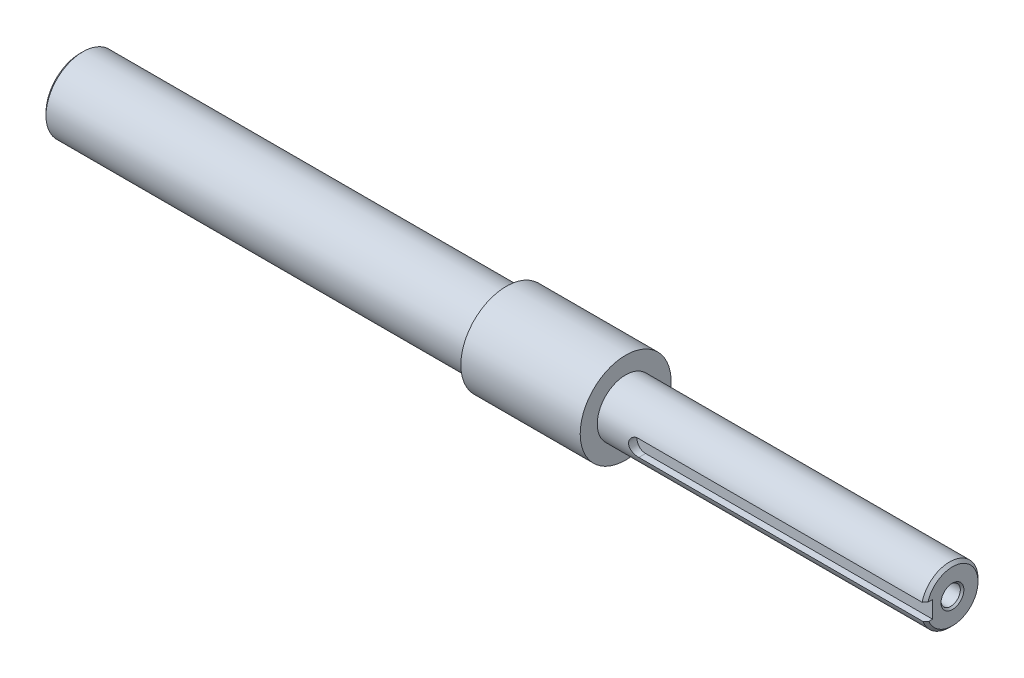
ISO-10303-21;
HEADER;
FILE_DESCRIPTION(('STEP AP214'),'2;1');
FILE_NAME('part.step','',(''),(''),'','','');
FILE_SCHEMA(('AUTOMOTIVE_DESIGN { 1 0 10303 214 1 1 1 1 }'));
ENDSEC;
DATA;
#1=APPLICATION_CONTEXT('core data for automotive mechanical design processes');
#2=APPLICATION_PROTOCOL_DEFINITION('international standard','automotive_design',2000,#1);
#3=PRODUCT_CONTEXT('',#1,'mechanical');
#4=PRODUCT('Part','Part','',(#3));
#5=PRODUCT_RELATED_PRODUCT_CATEGORY('part','',(#4));
#6=PRODUCT_DEFINITION_FORMATION('','',#4);
#7=PRODUCT_DEFINITION_CONTEXT('part definition',#1,'design');
#8=PRODUCT_DEFINITION('design','',#6,#7);
#9=PRODUCT_DEFINITION_SHAPE('','',#8);
#10=(LENGTH_UNIT() NAMED_UNIT(*) SI_UNIT(.MILLI.,.METRE.));
#11=(NAMED_UNIT(*) PLANE_ANGLE_UNIT() SI_UNIT($,.RADIAN.));
#12=(NAMED_UNIT(*) SI_UNIT($,.STERADIAN.) SOLID_ANGLE_UNIT());
#13=UNCERTAINTY_MEASURE_WITH_UNIT(LENGTH_MEASURE(1.E-05),#10,'distance_accuracy_value','');
#14=(GEOMETRIC_REPRESENTATION_CONTEXT(3) GLOBAL_UNCERTAINTY_ASSIGNED_CONTEXT((#13)) GLOBAL_UNIT_ASSIGNED_CONTEXT((#10,
#11,#12)) REPRESENTATION_CONTEXT('',''));
#15=CARTESIAN_POINT('',(0.,0.,0.));
#16=DIRECTION('',(0.,0.,1.));
#17=DIRECTION('',(1.,0.,0.));
#18=AXIS2_PLACEMENT_3D('',#15,#16,#17);
#19=CARTESIAN_POINT('',(0.,0.,0.));
#20=DIRECTION('',(1.,0.,0.));
#21=DIRECTION('',(0.,0.,-1.));
#22=AXIS2_PLACEMENT_3D('',#19,#20,#21);
#23=PLANE('',#22);
#24=CARTESIAN_POINT('',(0.,0.,0.));
#25=DIRECTION('',(1.,0.,0.));
#26=DIRECTION('',(0.,0.,-1.));
#27=AXIS2_PLACEMENT_3D('',#24,#25,#26);
#28=CIRCLE('',#27,12.);
#29=CARTESIAN_POINT('',(0.,0.,-12.));
#30=VERTEX_POINT('',#29);
#31=EDGE_CURVE('E228',#30,#30,#28,.F.);
#32=ORIENTED_EDGE('',*,*,#31,.T.);
#33=EDGE_LOOP('',(#32));
#34=FACE_BOUND('',#33,.T.);
#35=CARTESIAN_POINT('',(0.,0.,0.));
#36=DIRECTION('',(-1.,0.,0.));
#37=DIRECTION('',(0.,0.,1.));
#38=AXIS2_PLACEMENT_3D('',#35,#36,#37);
#39=CIRCLE('',#38,2.525);
#40=CARTESIAN_POINT('',(0.,0.,2.525));
#41=VERTEX_POINT('',#40);
#42=EDGE_CURVE('E166',#41,#41,#39,.T.);
#43=ORIENTED_EDGE('',*,*,#42,.F.);
#44=EDGE_LOOP('',(#43));
#45=FACE_BOUND('',#44,.T.);
#46=CARTESIAN_POINT('',(0.,8.,0.));
#47=DIRECTION('',(-1.,0.,0.));
#48=DIRECTION('',(0.,0.,1.));
#49=AXIS2_PLACEMENT_3D('',#46,#47,#48);
#50=CIRCLE('',#49,2.525);
#51=CARTESIAN_POINT('',(0.,8.,2.525));
#52=VERTEX_POINT('',#51);
#53=EDGE_CURVE('E178',#52,#52,#50,.T.);
#54=ORIENTED_EDGE('',*,*,#53,.F.);
#55=EDGE_LOOP('',(#54));
#56=FACE_BOUND('',#55,.T.);
#57=CARTESIAN_POINT('',(0.,-8.,0.));
#58=DIRECTION('',(-1.,0.,0.));
#59=DIRECTION('',(0.,0.,1.));
#60=AXIS2_PLACEMENT_3D('',#57,#58,#59);
#61=CIRCLE('',#60,2.525);
#62=CARTESIAN_POINT('',(0.,-8.,2.525));
#63=VERTEX_POINT('',#62);
#64=EDGE_CURVE('E190',#63,#63,#61,.T.);
#65=ORIENTED_EDGE('',*,*,#64,.F.);
#66=EDGE_LOOP('',(#65));
#67=FACE_BOUND('',#66,.T.);
#68=ADVANCED_FACE('F47',(#34,#45,#56,#67),#23,.F.);
#69=CARTESIAN_POINT('',(0.,0.,0.));
#70=DIRECTION('',(-1.,0.,0.));
#71=DIRECTION('',(0.,0.,1.));
#72=AXIS2_PLACEMENT_3D('',#69,#70,#71);
#73=CYLINDRICAL_SURFACE('',#72,13.);
#74=CARTESIAN_POINT('',(1.00000000000003,0.,0.));
#75=DIRECTION('',(1.,0.,0.));
#76=DIRECTION('',(0.,0.,-1.));
#77=AXIS2_PLACEMENT_3D('',#74,#75,#76);
#78=CIRCLE('',#77,13.);
#79=CARTESIAN_POINT('',(1.00000000000003,0.,-13.));
#80=VERTEX_POINT('',#79);
#81=EDGE_CURVE('E320',#80,#80,#78,.T.);
#82=ORIENTED_EDGE('',*,*,#81,.T.);
#83=EDGE_LOOP('',(#82));
#84=FACE_BOUND('',#83,.T.);
#85=CARTESIAN_POINT('',(150.,0.,0.));
#86=DIRECTION('',(-1.,0.,0.));
#87=DIRECTION('',(0.,0.,1.));
#88=AXIS2_PLACEMENT_3D('',#85,#86,#87);
#89=CIRCLE('',#88,13.);
#90=CARTESIAN_POINT('',(150.,0.,13.));
#91=VERTEX_POINT('',#90);
#92=EDGE_CURVE('E214',#91,#91,#89,.T.);
#93=ORIENTED_EDGE('',*,*,#92,.T.);
#94=EDGE_LOOP('',(#93));
#95=FACE_BOUND('',#94,.T.);
#96=ADVANCED_FACE('F293',(#84,#95),#73,.T.);
#97=CARTESIAN_POINT('',(150.,13.,0.));
#98=DIRECTION('',(1.,0.,0.));
#99=DIRECTION('',(0.,0.,-1.));
#100=AXIS2_PLACEMENT_3D('',#97,#98,#99);
#101=PLANE('',#100);
#102=ORIENTED_EDGE('',*,*,#92,.F.);
#103=EDGE_LOOP('',(#102));
#104=FACE_BOUND('',#103,.T.);
#105=CARTESIAN_POINT('',(150.,0.,0.));
#106=DIRECTION('',(-1.,0.,0.));
#107=DIRECTION('',(0.,0.,1.));
#108=AXIS2_PLACEMENT_3D('',#105,#106,#107);
#109=CIRCLE('',#108,16.);
#110=CARTESIAN_POINT('',(150.,0.,16.));
#111=VERTEX_POINT('',#110);
#112=EDGE_CURVE('E210',#111,#111,#109,.T.);
#113=ORIENTED_EDGE('',*,*,#112,.T.);
#114=EDGE_LOOP('',(#113));
#115=FACE_BOUND('',#114,.T.);
#116=ADVANCED_FACE('F299',(#104,#115),#101,.F.);
#117=CARTESIAN_POINT('',(0.,0.,0.));
#118=DIRECTION('',(-1.,0.,0.));
#119=DIRECTION('',(0.,0.,1.));
#120=AXIS2_PLACEMENT_3D('',#117,#118,#119);
#121=CYLINDRICAL_SURFACE('',#120,16.);
#122=ORIENTED_EDGE('',*,*,#112,.F.);
#123=EDGE_LOOP('',(#122));
#124=FACE_BOUND('',#123,.T.);
#125=CARTESIAN_POINT('',(192.,0.,0.));
#126=DIRECTION('',(-1.,0.,0.));
#127=DIRECTION('',(0.,0.,1.));
#128=AXIS2_PLACEMENT_3D('',#125,#126,#127);
#129=CIRCLE('',#128,16.);
#130=CARTESIAN_POINT('',(192.,0.,16.));
#131=VERTEX_POINT('',#130);
#132=EDGE_CURVE('E206',#131,#131,#129,.T.);
#133=ORIENTED_EDGE('',*,*,#132,.T.);
#134=EDGE_LOOP('',(#133));
#135=FACE_BOUND('',#134,.T.);
#136=ADVANCED_FACE('F389',(#124,#135),#121,.T.);
#137=CARTESIAN_POINT('',(192.,16.,0.));
#138=DIRECTION('',(-1.,0.,0.));
#139=DIRECTION('',(0.,0.,1.));
#140=AXIS2_PLACEMENT_3D('',#137,#138,#139);
#141=PLANE('',#140);
#142=ORIENTED_EDGE('',*,*,#132,.F.);
#143=EDGE_LOOP('',(#142));
#144=FACE_BOUND('',#143,.T.);
#145=CARTESIAN_POINT('',(192.,0.,0.));
#146=DIRECTION('',(-1.,0.,0.));
#147=DIRECTION('',(0.,0.,1.));
#148=AXIS2_PLACEMENT_3D('',#145,#146,#147);
#149=CIRCLE('',#148,10.);
#150=CARTESIAN_POINT('',(192.,0.,10.));
#151=VERTEX_POINT('',#150);
#152=EDGE_CURVE('E202',#151,#151,#149,.T.);
#153=ORIENTED_EDGE('',*,*,#152,.T.);
#154=EDGE_LOOP('',(#153));
#155=FACE_BOUND('',#154,.T.);
#156=ADVANCED_FACE('F289',(#144,#155),#141,.F.);
#157=CARTESIAN_POINT('',(0.,0.,0.));
#158=DIRECTION('',(-1.,0.,0.));
#159=DIRECTION('',(0.,0.,1.));
#160=AXIS2_PLACEMENT_3D('',#157,#158,#159);
#161=CYLINDRICAL_SURFACE('',#160,10.);
#162=ORIENTED_EDGE('',*,*,#152,.F.);
#163=EDGE_LOOP('',(#162));
#164=FACE_BOUND('',#163,.T.);
#165=DIRECTION('',(-1.,0.,0.));
#166=VECTOR('',#165,1.);
#167=CARTESIAN_POINT('',(0.,2.5281337308593,9.67515063649613));
#168=LINE('',#167,#166);
#169=CARTESIAN_POINT('',(206.,2.52813373085933,9.67515063649613));
#170=VERTEX_POINT('',#169);
#171=CARTESIAN_POINT('',(306.,2.5281337308593,9.67515063649613));
#172=VERTEX_POINT('',#171);
#173=EDGE_CURVE('E149',#170,#172,#168,.F.);
#174=ORIENTED_EDGE('',*,*,#173,.T.);
#175=CARTESIAN_POINT('',(306.,0.,0.));
#176=DIRECTION('',(-1.,0.,0.));
#177=DIRECTION('',(0.,0.,1.));
#178=AXIS2_PLACEMENT_3D('',#175,#176,#177);
#179=CIRCLE('',#178,10.);
#180=CARTESIAN_POINT('',(306.,-3.47186626914069,9.37796057835621));
#181=VERTEX_POINT('',#180);
#182=EDGE_CURVE('E324',#172,#181,#179,.T.);
#183=ORIENTED_EDGE('',*,*,#182,.T.);
#184=DIRECTION('',(-1.,0.,0.));
#185=VECTOR('',#184,1.);
#186=CARTESIAN_POINT('',(0.,-3.47186626914069,9.37796057835621));
#187=LINE('',#186,#185);
#188=CARTESIAN_POINT('',(206.,-3.47186626914067,9.37796057835622));
#189=VERTEX_POINT('',#188);
#190=EDGE_CURVE('E163',#181,#189,#187,.T.);
#191=ORIENTED_EDGE('',*,*,#190,.T.);
#192=CARTESIAN_POINT('',(206.,-3.47186626914067,9.37796057835622));
#193=CARTESIAN_POINT('',(205.918497968052,-3.47187724461606,9.37794820763439));
#194=CARTESIAN_POINT('',(205.837003256883,-3.46854522216418,9.37918988122942));
#195=CARTESIAN_POINT('',(205.674647701624,-3.45528056150861,9.38408905746635));
#196=CARTESIAN_POINT('',(205.593786689264,-3.44534974007048,9.38774589516938));
#197=CARTESIAN_POINT('',(205.433518525064,-3.41901324641803,9.39736844723101));
#198=CARTESIAN_POINT('',(205.354107673239,-3.40262753699443,9.40332704193992));
#199=CARTESIAN_POINT('',(205.197064989098,-3.36355288394829,9.41737439335968));
#200=CARTESIAN_POINT('',(205.119433222341,-3.34086370844816,9.42546322843239));
#201=CARTESIAN_POINT('',(204.890097569014,-3.26365173046185,9.45259688312245));
#202=CARTESIAN_POINT('',(204.741710508193,-3.19994405554963,9.47452444098541));
#203=CARTESIAN_POINT('',(204.45775182627,-3.05010442341664,9.52381480127256));
#204=CARTESIAN_POINT('',(204.322188356512,-2.96395833201245,9.55118102698371));
#205=CARTESIAN_POINT('',(204.062091477548,-2.76794732394001,9.60985417318686));
#206=CARTESIAN_POINT('',(203.938158068134,-2.6573175734672,9.64127000458211));
#207=CARTESIAN_POINT('',(203.710198103374,-2.41717712184177,9.70425928769233));
#208=CARTESIAN_POINT('',(203.606175988791,-2.28766222010432,9.73583277296107));
#209=CARTESIAN_POINT('',(203.417362544482,-2.00791530250381,9.79742185216433));
#210=CARTESIAN_POINT('',(203.333384409311,-1.85711130666906,9.82734243499937));
#211=CARTESIAN_POINT('',(203.192252138338,-1.54250087001966,9.8816057122918));
#212=CARTESIAN_POINT('',(203.135092283457,-1.37869721014182,9.9059495954301));
#213=CARTESIAN_POINT('',(203.050798511933,-1.04697772264103,9.94640844303072));
#214=CARTESIAN_POINT('',(203.022947682452,-0.879267978318753,9.96271442889378));
#215=CARTESIAN_POINT('',(202.996002876128,-0.540959669442063,9.98679567648439));
#216=CARTESIAN_POINT('',(202.996901359105,-0.370361874078141,9.99457317445366));
#217=CARTESIAN_POINT('',(203.026968033426,-0.0386637141176973,10.0012450036838));
#218=CARTESIAN_POINT('',(203.054963162015,0.122537257136537,10.0004941039956));
#219=CARTESIAN_POINT('',(203.136680315262,0.438055470264312,9.99164774717483));
#220=CARTESIAN_POINT('',(203.190402095082,0.5923727776338,9.98355235993852));
#221=CARTESIAN_POINT('',(203.321857230726,0.889735219567373,9.96145593412773));
#222=CARTESIAN_POINT('',(203.3995655834,1.0327918980258,9.94746103955871));
#223=CARTESIAN_POINT('',(203.576800950201,1.3041929850611,9.91553223122516));
#224=CARTESIAN_POINT('',(203.676331819149,1.43253478823272,9.89759762153166));
#225=CARTESIAN_POINT('',(203.898195618107,1.67530281018522,9.85946092675705));
#226=CARTESIAN_POINT('',(204.021168185494,1.78913615571929,9.83920384315683));
#227=CARTESIAN_POINT('',(204.284451072693,1.99487399513072,9.7995656500116));
#228=CARTESIAN_POINT('',(204.424766552021,2.08677193927629,9.78018480350056));
#229=CARTESIAN_POINT('',(204.721452809467,2.2473685485785,9.7445489665108));
#230=CARTESIAN_POINT('',(204.878046409483,2.31566828956027,9.72834955468477));
#231=CARTESIAN_POINT('',(205.200904694133,2.42475006203737,9.70174137975337));
#232=CARTESIAN_POINT('',(205.367156175723,2.46556874333109,9.69132490756378));
#233=CARTESIAN_POINT('',(205.612438307927,2.50401511895516,9.68142724953454));
#234=CARTESIAN_POINT('',(205.689714719783,2.51305895939751,9.67907988796813));
#235=CARTESIAN_POINT('',(205.844648010281,2.52511304640386,9.6759407238297));
#236=CARTESIAN_POINT('',(205.922304118342,2.52813257678655,9.67514652777505));
#237=CARTESIAN_POINT('',(206.,2.52813373085933,9.67515063649612));
#238=B_SPLINE_CURVE_WITH_KNOTS('',3,(#192,#193,#194,#195,#196,#197,#198,#199,#200,#201,#202,
#203,#204,#205,#206,#207,#208,#209,#210,#211,#212,#213,#214,#215,#216,#217,#218,#219,#220,#221,
#222,#223,#224,#225,#226,#227,#228,#229,#230,#231,#232,#233,#234,#235,#236,#237),.UNSPECIFIED.,
.F.,.F.,(4,2,2,2,2,2,2,2,2,2,2,2,2,2,2,2,2,2,2,2,2,2,4),(0.,0.244416196328535,0.4887651284408,
0.732364230784208,0.975972295284743,1.46245776413764,1.94925041928572,2.45419975972554,
2.95926158680808,3.48224187085863,4.00511057703164,4.5148692741758,5.02449427628965,
5.51300000297363,6.00150108068393,6.48949466395935,6.97757451802902,7.48162768690656,
7.98583117419604,8.49818307310341,9.00985031905664,9.24315653117533,9.47610292602618),.UNSPECIFIED.);
#239=EDGE_CURVE('E218',#189,#170,#238,.T.);
#240=ORIENTED_EDGE('',*,*,#239,.T.);
#241=EDGE_LOOP('',(#174,#183,#191,#240));
#242=FACE_BOUND('',#241,.T.);
#243=ADVANCED_FACE('F230',(#164,#242),#161,.T.);
#244=CARTESIAN_POINT('',(307.,10.,0.));
#245=DIRECTION('',(-1.,0.,0.));
#246=DIRECTION('',(0.,0.,1.));
#247=AXIS2_PLACEMENT_3D('',#244,#245,#246);
#248=PLANE('',#247);
#249=CARTESIAN_POINT('',(307.,0.,0.));
#250=DIRECTION('',(1.,0.,0.));
#251=DIRECTION('',(0.,0.,-1.));
#252=AXIS2_PLACEMENT_3D('',#249,#250,#251);
#253=CIRCLE('',#252,4.025);
#254=CARTESIAN_POINT('',(307.,0.,-4.025));
#255=VERTEX_POINT('',#254);
#256=EDGE_CURVE('E131',#255,#255,#253,.T.);
#257=ORIENTED_EDGE('',*,*,#256,.F.);
#258=EDGE_LOOP('',(#257));
#259=FACE_BOUND('',#258,.T.);
#260=DIRECTION('',(0.,0.,1.));
#261=VECTOR('',#260,1.);
#262=CARTESIAN_POINT('',(307.,-3.47186626914066,7.));
#263=LINE('',#262,#261);
#264=CARTESIAN_POINT('',(307.,-3.47186626914067,7.));
#265=VERTEX_POINT('',#264);
#266=CARTESIAN_POINT('',(307.,-3.47186626914066,8.30338151653899));
#267=VERTEX_POINT('',#266);
#268=EDGE_CURVE('E146',#265,#267,#263,.T.);
#269=ORIENTED_EDGE('',*,*,#268,.T.);
#270=CARTESIAN_POINT('',(307.,0.,0.));
#271=DIRECTION('',(-1.,0.,0.));
#272=DIRECTION('',(0.,0.,1.));
#273=AXIS2_PLACEMENT_3D('',#270,#271,#272);
#274=CIRCLE('',#273,8.99999999999988);
#275=CARTESIAN_POINT('',(307.,2.52813373085934,8.6376235064333));
#276=VERTEX_POINT('',#275);
#277=EDGE_CURVE('E63',#267,#276,#274,.F.);
#278=ORIENTED_EDGE('',*,*,#277,.T.);
#279=DIRECTION('',(0.,0.,1.));
#280=VECTOR('',#279,1.);
#281=CARTESIAN_POINT('',(307.,2.52813373085934,7.));
#282=LINE('',#281,#280);
#283=CARTESIAN_POINT('',(307.,2.52813373085934,7.));
#284=VERTEX_POINT('',#283);
#285=EDGE_CURVE('E145',#284,#276,#282,.T.);
#286=ORIENTED_EDGE('',*,*,#285,.F.);
#287=DIRECTION('',(0.,1.,0.));
#288=VECTOR('',#287,1.);
#289=CARTESIAN_POINT('',(307.,2.52813373085934,7.));
#290=LINE('',#289,#288);
#291=EDGE_CURVE('E122',#265,#284,#290,.T.);
#292=ORIENTED_EDGE('',*,*,#291,.F.);
#293=EDGE_LOOP('',(#269,#278,#286,#292));
#294=FACE_BOUND('',#293,.T.);
#295=ADVANCED_FACE('F282',(#259,#294),#248,.F.);
#296=CARTESIAN_POINT('',(15.,-8.,0.));
#297=DIRECTION('',(-1.,0.,0.));
#298=DIRECTION('',(0.,0.,1.));
#299=AXIS2_PLACEMENT_3D('',#296,#297,#298);
#300=CONICAL_SURFACE('',#299,2.5,1.02974425867665);
#301=CARTESIAN_POINT('',(16.5021515475689,-8.,0.));
#302=VERTEX_POINT('',#301);
#303=VERTEX_LOOP('',#302);
#304=FACE_BOUND('',#303,.T.);
#305=CARTESIAN_POINT('',(15.,-8.,0.));
#306=DIRECTION('',(-1.,0.,0.));
#307=DIRECTION('',(0.,0.,1.));
#308=AXIS2_PLACEMENT_3D('',#305,#306,#307);
#309=CIRCLE('',#308,2.5);
#310=CARTESIAN_POINT('',(15.,-8.,2.5));
#311=VERTEX_POINT('',#310);
#312=EDGE_CURVE('E198',#311,#311,#309,.T.);
#313=ORIENTED_EDGE('',*,*,#312,.T.);
#314=EDGE_LOOP('',(#313));
#315=FACE_BOUND('',#314,.T.);
#316=ADVANCED_FACE('F279',(#304,#315),#300,.F.);
#317=CARTESIAN_POINT('',(0.,-8.,0.));
#318=DIRECTION('',(-1.,0.,0.));
#319=DIRECTION('',(0.,0.,1.));
#320=AXIS2_PLACEMENT_3D('',#317,#318,#319);
#321=CYLINDRICAL_SURFACE('',#320,2.5);
#322=ORIENTED_EDGE('',*,*,#312,.F.);
#323=EDGE_LOOP('',(#322));
#324=FACE_BOUND('',#323,.T.);
#325=CARTESIAN_POINT('',(0.0250000000000077,-8.,0.));
#326=DIRECTION('',(-1.,0.,0.));
#327=DIRECTION('',(0.,0.,1.));
#328=AXIS2_PLACEMENT_3D('',#325,#326,#327);
#329=CIRCLE('',#328,2.5);
#330=CARTESIAN_POINT('',(0.0250000000000077,-8.,2.5));
#331=VERTEX_POINT('',#330);
#332=EDGE_CURVE('E194',#331,#331,#329,.T.);
#333=ORIENTED_EDGE('',*,*,#332,.T.);
#334=EDGE_LOOP('',(#333));
#335=FACE_BOUND('',#334,.T.);
#336=ADVANCED_FACE('F275',(#324,#335),#321,.F.);
#337=CARTESIAN_POINT('',(0.,-8.,0.));
#338=DIRECTION('',(-1.,0.,0.));
#339=DIRECTION('',(0.,0.,1.));
#340=AXIS2_PLACEMENT_3D('',#337,#338,#339);
#341=CONICAL_SURFACE('',#340,2.525,0.78539816339731);
#342=ORIENTED_EDGE('',*,*,#332,.F.);
#343=EDGE_LOOP('',(#342));
#344=FACE_BOUND('',#343,.T.);
#345=ORIENTED_EDGE('',*,*,#64,.T.);
#346=EDGE_LOOP('',(#345));
#347=FACE_BOUND('',#346,.T.);
#348=ADVANCED_FACE('F271',(#344,#347),#341,.F.);
#349=CARTESIAN_POINT('',(15.,8.,0.));
#350=DIRECTION('',(-1.,0.,0.));
#351=DIRECTION('',(0.,0.,1.));
#352=AXIS2_PLACEMENT_3D('',#349,#350,#351);
#353=CONICAL_SURFACE('',#352,2.5,1.02974425867665);
#354=CARTESIAN_POINT('',(16.5021515475689,8.,0.));
#355=VERTEX_POINT('',#354);
#356=VERTEX_LOOP('',#355);
#357=FACE_BOUND('',#356,.T.);
#358=CARTESIAN_POINT('',(15.,8.,0.));
#359=DIRECTION('',(-1.,0.,0.));
#360=DIRECTION('',(0.,0.,1.));
#361=AXIS2_PLACEMENT_3D('',#358,#359,#360);
#362=CIRCLE('',#361,2.5);
#363=CARTESIAN_POINT('',(15.,8.,2.5));
#364=VERTEX_POINT('',#363);
#365=EDGE_CURVE('E186',#364,#364,#362,.T.);
#366=ORIENTED_EDGE('',*,*,#365,.T.);
#367=EDGE_LOOP('',(#366));
#368=FACE_BOUND('',#367,.T.);
#369=ADVANCED_FACE('F267',(#357,#368),#353,.F.);
#370=CARTESIAN_POINT('',(0.,8.,0.));
#371=DIRECTION('',(-1.,0.,0.));
#372=DIRECTION('',(0.,0.,1.));
#373=AXIS2_PLACEMENT_3D('',#370,#371,#372);
#374=CYLINDRICAL_SURFACE('',#373,2.5);
#375=ORIENTED_EDGE('',*,*,#365,.F.);
#376=EDGE_LOOP('',(#375));
#377=FACE_BOUND('',#376,.T.);
#378=CARTESIAN_POINT('',(0.0250000000000077,8.,0.));
#379=DIRECTION('',(-1.,0.,0.));
#380=DIRECTION('',(0.,0.,1.));
#381=AXIS2_PLACEMENT_3D('',#378,#379,#380);
#382=CIRCLE('',#381,2.5);
#383=CARTESIAN_POINT('',(0.0250000000000077,8.,2.5));
#384=VERTEX_POINT('',#383);
#385=EDGE_CURVE('E182',#384,#384,#382,.T.);
#386=ORIENTED_EDGE('',*,*,#385,.T.);
#387=EDGE_LOOP('',(#386));
#388=FACE_BOUND('',#387,.T.);
#389=ADVANCED_FACE('F263',(#377,#388),#374,.F.);
#390=CARTESIAN_POINT('',(0.,8.,0.));
#391=DIRECTION('',(-1.,0.,0.));
#392=DIRECTION('',(0.,0.,1.));
#393=AXIS2_PLACEMENT_3D('',#390,#391,#392);
#394=CONICAL_SURFACE('',#393,2.525,0.78539816339731);
#395=ORIENTED_EDGE('',*,*,#385,.F.);
#396=EDGE_LOOP('',(#395));
#397=FACE_BOUND('',#396,.T.);
#398=ORIENTED_EDGE('',*,*,#53,.T.);
#399=EDGE_LOOP('',(#398));
#400=FACE_BOUND('',#399,.T.);
#401=ADVANCED_FACE('F259',(#397,#400),#394,.F.);
#402=CARTESIAN_POINT('',(15.,0.,0.));
#403=DIRECTION('',(-1.,0.,0.));
#404=DIRECTION('',(0.,0.,1.));
#405=AXIS2_PLACEMENT_3D('',#402,#403,#404);
#406=CONICAL_SURFACE('',#405,2.1,1.02974425867665);
#407=CARTESIAN_POINT('',(16.2618072999579,0.,0.));
#408=VERTEX_POINT('',#407);
#409=VERTEX_LOOP('',#408);
#410=FACE_BOUND('',#409,.T.);
#411=CARTESIAN_POINT('',(15.,0.,0.));
#412=DIRECTION('',(-1.,0.,0.));
#413=DIRECTION('',(0.,0.,1.));
#414=AXIS2_PLACEMENT_3D('',#411,#412,#413);
#415=CIRCLE('',#414,2.1);
#416=CARTESIAN_POINT('',(15.,0.,2.1));
#417=VERTEX_POINT('',#416);
#418=EDGE_CURVE('E174',#417,#417,#415,.T.);
#419=ORIENTED_EDGE('',*,*,#418,.T.);
#420=EDGE_LOOP('',(#419));
#421=FACE_BOUND('',#420,.T.);
#422=ADVANCED_FACE('F255',(#410,#421),#406,.F.);
#423=CARTESIAN_POINT('',(0.,0.,0.));
#424=DIRECTION('',(-1.,0.,0.));
#425=DIRECTION('',(0.,0.,1.));
#426=AXIS2_PLACEMENT_3D('',#423,#424,#425);
#427=CYLINDRICAL_SURFACE('',#426,2.1);
#428=ORIENTED_EDGE('',*,*,#418,.F.);
#429=EDGE_LOOP('',(#428));
#430=FACE_BOUND('',#429,.T.);
#431=CARTESIAN_POINT('',(0.425000000000003,0.,0.));
#432=DIRECTION('',(-1.,0.,0.));
#433=DIRECTION('',(0.,0.,1.));
#434=AXIS2_PLACEMENT_3D('',#431,#432,#433);
#435=CIRCLE('',#434,2.1);
#436=CARTESIAN_POINT('',(0.425000000000003,0.,2.1));
#437=VERTEX_POINT('',#436);
#438=EDGE_CURVE('E170',#437,#437,#435,.T.);
#439=ORIENTED_EDGE('',*,*,#438,.T.);
#440=EDGE_LOOP('',(#439));
#441=FACE_BOUND('',#440,.T.);
#442=ADVANCED_FACE('F251',(#430,#441),#427,.F.);
#443=CARTESIAN_POINT('',(0.,0.,0.));
#444=DIRECTION('',(-1.,0.,0.));
#445=DIRECTION('',(0.,0.,1.));
#446=AXIS2_PLACEMENT_3D('',#443,#444,#445);
#447=CONICAL_SURFACE('',#446,2.525,0.785398163397446);
#448=ORIENTED_EDGE('',*,*,#438,.F.);
#449=EDGE_LOOP('',(#448));
#450=FACE_BOUND('',#449,.T.);
#451=ORIENTED_EDGE('',*,*,#42,.T.);
#452=EDGE_LOOP('',(#451));
#453=FACE_BOUND('',#452,.T.);
#454=ADVANCED_FACE('F239',(#450,#453),#447,.F.);
#455=CARTESIAN_POINT('',(206.,-0.47186626914067,7.));
#456=DIRECTION('',(0.,0.,1.));
#457=DIRECTION('',(1.,0.,0.));
#458=AXIS2_PLACEMENT_3D('',#455,#456,#457);
#459=CYLINDRICAL_SURFACE('',#458,3.);
#460=DIRECTION('',(0.,0.,1.));
#461=VECTOR('',#460,1.);
#462=CARTESIAN_POINT('',(206.,-3.47186626914067,7.));
#463=LINE('',#462,#461);
#464=CARTESIAN_POINT('',(206.,-3.47186626914067,7.));
#465=VERTEX_POINT('',#464);
#466=EDGE_CURVE('E150',#465,#189,#463,.T.);
#467=ORIENTED_EDGE('',*,*,#466,.F.);
#468=CARTESIAN_POINT('',(206.,-0.47186626914067,7.));
#469=DIRECTION('',(0.,0.,1.));
#470=DIRECTION('',(1.,0.,0.));
#471=AXIS2_PLACEMENT_3D('',#468,#469,#470);
#472=CIRCLE('',#471,3.);
#473=CARTESIAN_POINT('',(206.,2.52813373085933,7.));
#474=VERTEX_POINT('',#473);
#475=EDGE_CURVE('E138',#474,#465,#472,.T.);
#476=ORIENTED_EDGE('',*,*,#475,.F.);
#477=DIRECTION('',(0.,0.,1.));
#478=VECTOR('',#477,1.);
#479=CARTESIAN_POINT('',(206.,2.52813373085933,7.));
#480=LINE('',#479,#478);
#481=EDGE_CURVE('E154',#474,#170,#480,.T.);
#482=ORIENTED_EDGE('',*,*,#481,.T.);
#483=ORIENTED_EDGE('',*,*,#239,.F.);
#484=EDGE_LOOP('',(#467,#476,#482,#483));
#485=FACE_BOUND('',#484,.T.);
#486=ADVANCED_FACE('F234',(#485),#459,.F.);
#487=CARTESIAN_POINT('',(307.,-3.47186626914066,7.));
#488=DIRECTION('',(0.,-1.,0.));
#489=DIRECTION('',(1.,0.,0.));
#490=AXIS2_PLACEMENT_3D('',#487,#488,#489);
#491=PLANE('',#490);
#492=ORIENTED_EDGE('',*,*,#190,.F.);
#493=CARTESIAN_POINT('',(306.,-3.47186626914069,9.37796057835621));
#494=CARTESIAN_POINT('',(306.083677078154,-3.47186626914067,9.28873272125712));
#495=CARTESIAN_POINT('',(306.167278069465,-3.47186626914066,9.19943346212486));
#496=CARTESIAN_POINT('',(306.33431315548,-3.47186626914065,9.02067968780231));
#497=CARTESIAN_POINT('',(306.417747250871,-3.47186626914066,8.93122517325435));
#498=CARTESIAN_POINT('',(306.584434563802,-3.47186626914066,8.7521476452878));
#499=CARTESIAN_POINT('',(306.667687781232,-3.47186626914066,8.66252463176674));
#500=CARTESIAN_POINT('',(306.833996523726,-3.47186626914066,8.48309469185376));
#501=CARTESIAN_POINT('',(306.917052047973,-3.47186626914066,8.39328776470405));
#502=CARTESIAN_POINT('',(307.,-3.47186626914066,8.30338151653899));
#503=B_SPLINE_CURVE_WITH_KNOTS('',3,(#493,#494,#495,#496,#497,#498,#499,#500,#501,#502),
.UNSPECIFIED.,.F.,.F.,(4,2,2,2,4),(0.,0.36697572065307,0.733949926658527,1.10092435594331,
1.46790030036658),.UNSPECIFIED.);
#504=EDGE_CURVE('E77',#181,#267,#503,.T.);
#505=ORIENTED_EDGE('',*,*,#504,.T.);
#506=ORIENTED_EDGE('',*,*,#268,.F.);
#507=DIRECTION('',(1.,0.,0.));
#508=VECTOR('',#507,1.);
#509=CARTESIAN_POINT('',(307.,-3.47186626914066,7.));
#510=LINE('',#509,#508);
#511=EDGE_CURVE('E142',#465,#265,#510,.T.);
#512=ORIENTED_EDGE('',*,*,#511,.F.);
#513=ORIENTED_EDGE('',*,*,#466,.T.);
#514=EDGE_LOOP('',(#492,#505,#506,#512,#513));
#515=FACE_BOUND('',#514,.T.);
#516=ADVANCED_FACE('F238',(#515),#491,.F.);
#517=CARTESIAN_POINT('',(307.,2.52813373085934,7.));
#518=DIRECTION('',(0.,1.,0.));
#519=DIRECTION('',(-1.,0.,0.));
#520=AXIS2_PLACEMENT_3D('',#517,#518,#519);
#521=PLANE('',#520);
#522=ORIENTED_EDGE('',*,*,#285,.T.);
#523=CARTESIAN_POINT('',(307.,2.52813373085934,8.6376235064333));
#524=CARTESIAN_POINT('',(306.833681036395,2.52813373085934,8.81087983924238));
#525=CARTESIAN_POINT('',(306.667188216815,2.52813373085934,8.98396860441028));
#526=CARTESIAN_POINT('',(306.333854883445,2.52813373085934,9.32981098106222));
#527=CARTESIAN_POINT('',(306.167014369691,2.52813373085934,9.50256459258193));
#528=CARTESIAN_POINT('',(306.,2.52813373085934,9.67515063649613));
#529=B_SPLINE_CURVE_WITH_KNOTS('',3,(#523,#524,#525,#526,#527,#528),.UNSPECIFIED.,.F.,.F.,(4,2,
4),(0.,0.720497200819924,1.44099432496783),.UNSPECIFIED.);
#530=EDGE_CURVE('E11',#276,#172,#529,.T.);
#531=ORIENTED_EDGE('',*,*,#530,.T.);
#532=ORIENTED_EDGE('',*,*,#173,.F.);
#533=ORIENTED_EDGE('',*,*,#481,.F.);
#534=DIRECTION('',(-1.,0.,0.));
#535=VECTOR('',#534,1.);
#536=CARTESIAN_POINT('',(307.,2.52813373085934,7.));
#537=LINE('',#536,#535);
#538=EDGE_CURVE('E128',#284,#474,#537,.T.);
#539=ORIENTED_EDGE('',*,*,#538,.F.);
#540=EDGE_LOOP('',(#522,#531,#532,#533,#539));
#541=FACE_BOUND('',#540,.T.);
#542=ADVANCED_FACE('F243',(#541),#521,.F.);
#543=CARTESIAN_POINT('',(206.,-0.47186626914067,7.));
#544=DIRECTION('',(0.,0.,1.));
#545=DIRECTION('',(1.,0.,0.));
#546=AXIS2_PLACEMENT_3D('',#543,#544,#545);
#547=PLANE('',#546);
#548=ORIENTED_EDGE('',*,*,#291,.T.);
#549=ORIENTED_EDGE('',*,*,#538,.T.);
#550=ORIENTED_EDGE('',*,*,#475,.T.);
#551=ORIENTED_EDGE('',*,*,#511,.T.);
#552=EDGE_LOOP('',(#548,#549,#550,#551));
#553=FACE_BOUND('',#552,.T.);
#554=ADVANCED_FACE('F247',(#553),#547,.T.);
#555=CARTESIAN_POINT('',(0.,0.,0.));
#556=DIRECTION('',(1.,0.,0.));
#557=DIRECTION('',(0.,0.,-1.));
#558=AXIS2_PLACEMENT_3D('',#555,#556,#557);
#559=CONICAL_SURFACE('',#558,12.,0.785398163397441);
#560=ORIENTED_EDGE('',*,*,#81,.F.);
#561=EDGE_LOOP('',(#560));
#562=FACE_BOUND('',#561,.T.);
#563=ORIENTED_EDGE('',*,*,#31,.F.);
#564=EDGE_LOOP('',(#563));
#565=FACE_BOUND('',#564,.T.);
#566=ADVANCED_FACE('F306',(#562,#565),#559,.T.);
#567=CARTESIAN_POINT('',(306.,0.,0.));
#568=DIRECTION('',(-1.,0.,0.));
#569=DIRECTION('',(0.,0.,1.));
#570=AXIS2_PLACEMENT_3D('',#567,#568,#569);
#571=CONICAL_SURFACE('',#570,10.,0.785398163397451);
#572=ORIENTED_EDGE('',*,*,#530,.F.);
#573=ORIENTED_EDGE('',*,*,#277,.F.);
#574=ORIENTED_EDGE('',*,*,#504,.F.);
#575=ORIENTED_EDGE('',*,*,#182,.F.);
#576=EDGE_LOOP('',(#572,#573,#574,#575));
#577=FACE_BOUND('',#576,.T.);
#578=ADVANCED_FACE('F50',(#577),#571,.T.);
#579=CARTESIAN_POINT('',(291.,0.,0.));
#580=DIRECTION('',(1.,0.,0.));
#581=DIRECTION('',(0.,0.,-1.));
#582=AXIS2_PLACEMENT_3D('',#579,#580,#581);
#583=CONICAL_SURFACE('',#582,3.4,1.02974425867665);
#584=CARTESIAN_POINT('',(288.957073895306,0.,0.));
#585=VERTEX_POINT('',#584);
#586=VERTEX_LOOP('',#585);
#587=FACE_BOUND('',#586,.T.);
#588=CARTESIAN_POINT('',(291.,0.,0.));
#589=DIRECTION('',(1.,0.,0.));
#590=DIRECTION('',(0.,0.,-1.));
#591=AXIS2_PLACEMENT_3D('',#588,#589,#590);
#592=CIRCLE('',#591,3.4);
#593=CARTESIAN_POINT('',(291.,0.,-3.4));
#594=VERTEX_POINT('',#593);
#595=EDGE_CURVE('E119',#594,#594,#592,.T.);
#596=ORIENTED_EDGE('',*,*,#595,.T.);
#597=EDGE_LOOP('',(#596));
#598=FACE_BOUND('',#597,.T.);
#599=ADVANCED_FACE('F112',(#587,#598),#583,.F.);
#600=CARTESIAN_POINT('',(307.,0.,0.));
#601=DIRECTION('',(1.,0.,0.));
#602=DIRECTION('',(0.,0.,-1.));
#603=AXIS2_PLACEMENT_3D('',#600,#601,#602);
#604=CYLINDRICAL_SURFACE('',#603,3.4);
#605=ORIENTED_EDGE('',*,*,#595,.F.);
#606=EDGE_LOOP('',(#605));
#607=FACE_BOUND('',#606,.T.);
#608=CARTESIAN_POINT('',(306.375,0.,0.));
#609=DIRECTION('',(1.,0.,0.));
#610=DIRECTION('',(0.,0.,-1.));
#611=AXIS2_PLACEMENT_3D('',#608,#609,#610);
#612=CIRCLE('',#611,3.4);
#613=CARTESIAN_POINT('',(306.375,0.,-3.4));
#614=VERTEX_POINT('',#613);
#615=EDGE_CURVE('E123',#614,#614,#612,.T.);
#616=ORIENTED_EDGE('',*,*,#615,.T.);
#617=EDGE_LOOP('',(#616));
#618=FACE_BOUND('',#617,.T.);
#619=ADVANCED_FACE('F115',(#607,#618),#604,.F.);
#620=CARTESIAN_POINT('',(307.,0.,0.));
#621=DIRECTION('',(1.,0.,0.));
#622=DIRECTION('',(0.,0.,-1.));
#623=AXIS2_PLACEMENT_3D('',#620,#621,#622);
#624=CONICAL_SURFACE('',#623,4.025,0.785398163397462);
#625=ORIENTED_EDGE('',*,*,#615,.F.);
#626=EDGE_LOOP('',(#625));
#627=FACE_BOUND('',#626,.T.);
#628=ORIENTED_EDGE('',*,*,#256,.T.);
#629=EDGE_LOOP('',(#628));
#630=FACE_BOUND('',#629,.T.);
#631=ADVANCED_FACE('F482',(#627,#630),#624,.F.);
#632=CLOSED_SHELL('',(#68,#96,#116,#136,#156,#243,#295,#316,#336,#348,#369,#389,#401,#422,#442,
#454,#486,#516,#542,#554,#566,#578,#599,#619,#631));
#633=MANIFOLD_SOLID_BREP('B2',#632);
#634=ADVANCED_BREP_SHAPE_REPRESENTATION('',(#18,#633),#14);
#635=SHAPE_DEFINITION_REPRESENTATION(#9,#634);
ENDSEC;
END-ISO-10303-21;
